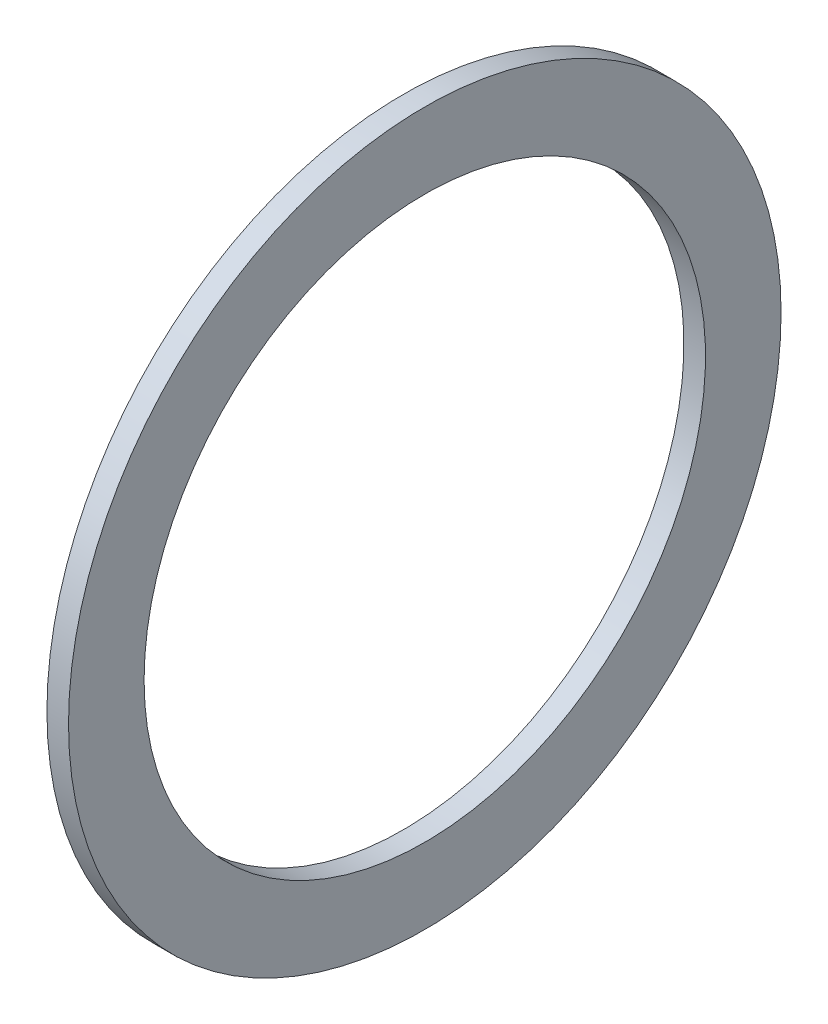
ISO-10303-21;
HEADER;
FILE_DESCRIPTION(('STEP AP214'),'2;1');
FILE_NAME('part.step','',(''),(''),'','','');
FILE_SCHEMA(('AUTOMOTIVE_DESIGN { 1 0 10303 214 1 1 1 1 }'));
ENDSEC;
DATA;
#1=APPLICATION_CONTEXT('core data for automotive mechanical design processes');
#2=APPLICATION_PROTOCOL_DEFINITION('international standard','automotive_design',2000,#1);
#3=PRODUCT_CONTEXT('',#1,'mechanical');
#4=PRODUCT('Part','Part','',(#3));
#5=PRODUCT_RELATED_PRODUCT_CATEGORY('part','',(#4));
#6=PRODUCT_DEFINITION_FORMATION('','',#4);
#7=PRODUCT_DEFINITION_CONTEXT('part definition',#1,'design');
#8=PRODUCT_DEFINITION('design','',#6,#7);
#9=PRODUCT_DEFINITION_SHAPE('','',#8);
#10=(LENGTH_UNIT() NAMED_UNIT(*) SI_UNIT(.MILLI.,.METRE.));
#11=(NAMED_UNIT(*) PLANE_ANGLE_UNIT() SI_UNIT($,.RADIAN.));
#12=(NAMED_UNIT(*) SI_UNIT($,.STERADIAN.) SOLID_ANGLE_UNIT());
#13=UNCERTAINTY_MEASURE_WITH_UNIT(LENGTH_MEASURE(1.E-05),#10,'distance_accuracy_value','');
#14=(GEOMETRIC_REPRESENTATION_CONTEXT(3) GLOBAL_UNCERTAINTY_ASSIGNED_CONTEXT((#13)) GLOBAL_UNIT_ASSIGNED_CONTEXT((#10,
#11,#12)) REPRESENTATION_CONTEXT('',''));
#15=CARTESIAN_POINT('',(0.,0.,0.));
#16=DIRECTION('',(0.,0.,1.));
#17=DIRECTION('',(1.,0.,0.));
#18=AXIS2_PLACEMENT_3D('',#15,#16,#17);
#19=CARTESIAN_POINT('',(0.,16.5,0.));
#20=DIRECTION('',(1.,0.,0.));
#21=DIRECTION('',(0.,0.,-1.));
#22=AXIS2_PLACEMENT_3D('',#19,#20,#21);
#23=PLANE('',#22);
#24=CARTESIAN_POINT('',(0.,0.,0.));
#25=DIRECTION('',(-1.,0.,0.));
#26=DIRECTION('',(0.,0.,1.));
#27=AXIS2_PLACEMENT_3D('',#24,#25,#26);
#28=CIRCLE('',#27,13.);
#29=CARTESIAN_POINT('',(0.,0.,13.));
#30=VERTEX_POINT('',#29);
#31=EDGE_CURVE('E10',#30,#30,#28,.T.);
#32=ORIENTED_EDGE('',*,*,#31,.F.);
#33=EDGE_LOOP('',(#32));
#34=FACE_BOUND('',#33,.T.);
#35=CARTESIAN_POINT('',(0.,0.,0.));
#36=DIRECTION('',(-1.,0.,0.));
#37=DIRECTION('',(0.,0.,1.));
#38=AXIS2_PLACEMENT_3D('',#35,#36,#37);
#39=CIRCLE('',#38,16.5);
#40=CARTESIAN_POINT('',(0.,0.,16.5));
#41=VERTEX_POINT('',#40);
#42=EDGE_CURVE('E45',#41,#41,#39,.T.);
#43=ORIENTED_EDGE('',*,*,#42,.T.);
#44=EDGE_LOOP('',(#43));
#45=FACE_BOUND('',#44,.T.);
#46=ADVANCED_FACE('F31',(#34,#45),#23,.F.);
#47=CARTESIAN_POINT('',(-110.,0.,0.));
#48=DIRECTION('',(-1.,0.,0.));
#49=DIRECTION('',(0.,0.,1.));
#50=AXIS2_PLACEMENT_3D('',#47,#48,#49);
#51=CYLINDRICAL_SURFACE('',#50,13.);
#52=CARTESIAN_POINT('',(1.,0.,0.));
#53=DIRECTION('',(-1.,0.,0.));
#54=DIRECTION('',(0.,0.,1.));
#55=AXIS2_PLACEMENT_3D('',#52,#53,#54);
#56=CIRCLE('',#55,13.);
#57=CARTESIAN_POINT('',(1.,0.,13.));
#58=VERTEX_POINT('',#57);
#59=EDGE_CURVE('E37',#58,#58,#56,.T.);
#60=ORIENTED_EDGE('',*,*,#59,.F.);
#61=EDGE_LOOP('',(#60));
#62=FACE_BOUND('',#61,.T.);
#63=ORIENTED_EDGE('',*,*,#31,.T.);
#64=EDGE_LOOP('',(#63));
#65=FACE_BOUND('',#64,.T.);
#66=ADVANCED_FACE('F60',(#62,#65),#51,.F.);
#67=CARTESIAN_POINT('',(1.,13.,0.));
#68=DIRECTION('',(-1.,0.,0.));
#69=DIRECTION('',(0.,0.,1.));
#70=AXIS2_PLACEMENT_3D('',#67,#68,#69);
#71=PLANE('',#70);
#72=CARTESIAN_POINT('',(1.,0.,0.));
#73=DIRECTION('',(-1.,0.,0.));
#74=DIRECTION('',(0.,0.,1.));
#75=AXIS2_PLACEMENT_3D('',#72,#73,#74);
#76=CIRCLE('',#75,16.5);
#77=CARTESIAN_POINT('',(1.,0.,16.5));
#78=VERTEX_POINT('',#77);
#79=EDGE_CURVE('E41',#78,#78,#76,.T.);
#80=ORIENTED_EDGE('',*,*,#79,.F.);
#81=EDGE_LOOP('',(#80));
#82=FACE_BOUND('',#81,.T.);
#83=ORIENTED_EDGE('',*,*,#59,.T.);
#84=EDGE_LOOP('',(#83));
#85=FACE_BOUND('',#84,.T.);
#86=ADVANCED_FACE('F55',(#82,#85),#71,.F.);
#87=CARTESIAN_POINT('',(-110.,0.,0.));
#88=DIRECTION('',(-1.,0.,0.));
#89=DIRECTION('',(0.,0.,1.));
#90=AXIS2_PLACEMENT_3D('',#87,#88,#89);
#91=CYLINDRICAL_SURFACE('',#90,16.5);
#92=ORIENTED_EDGE('',*,*,#42,.F.);
#93=EDGE_LOOP('',(#92));
#94=FACE_BOUND('',#93,.T.);
#95=ORIENTED_EDGE('',*,*,#79,.T.);
#96=EDGE_LOOP('',(#95));
#97=FACE_BOUND('',#96,.T.);
#98=ADVANCED_FACE('F52',(#94,#97),#91,.T.);
#99=CLOSED_SHELL('',(#46,#66,#86,#98));
#100=MANIFOLD_SOLID_BREP('B2',#99);
#101=ADVANCED_BREP_SHAPE_REPRESENTATION('',(#18,#100),#14);
#102=SHAPE_DEFINITION_REPRESENTATION(#9,#101);
ENDSEC;
END-ISO-10303-21;
